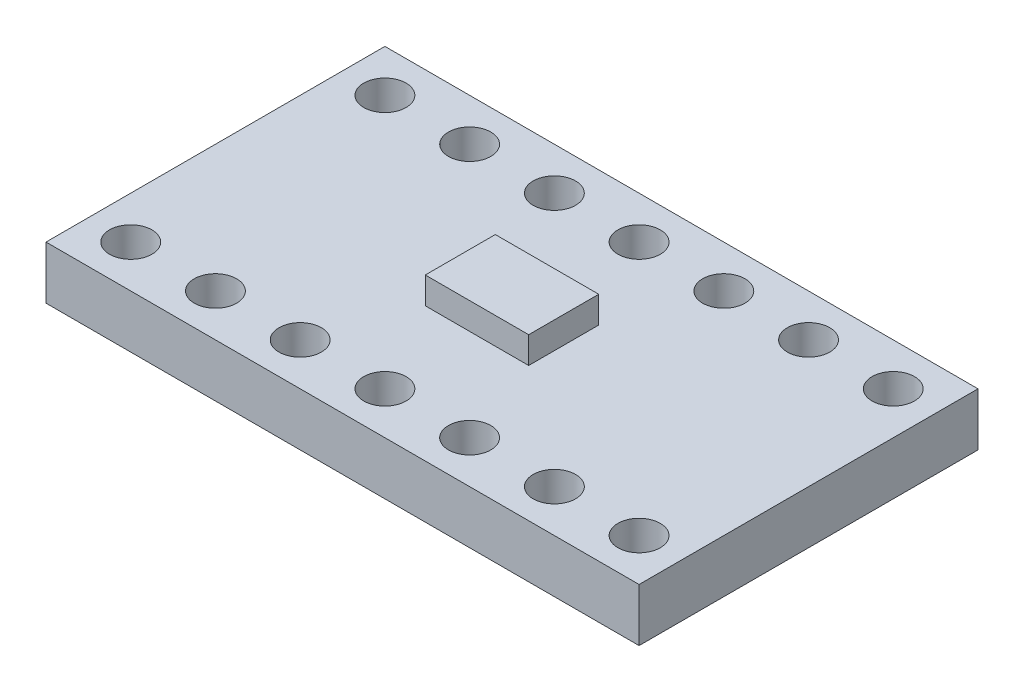
ISO-10303-21;
HEADER;
FILE_DESCRIPTION(('STEP AP214'),'2;1');
FILE_NAME('part.step','',(''),(''),'','','');
FILE_SCHEMA(('AUTOMOTIVE_DESIGN { 1 0 10303 214 1 1 1 1 }'));
ENDSEC;
DATA;
#1=APPLICATION_CONTEXT('core data for automotive mechanical design processes');
#2=APPLICATION_PROTOCOL_DEFINITION('international standard','automotive_design',2000,#1);
#3=PRODUCT_CONTEXT('',#1,'mechanical');
#4=PRODUCT('Part','Part','',(#3));
#5=PRODUCT_RELATED_PRODUCT_CATEGORY('part','',(#4));
#6=PRODUCT_DEFINITION_FORMATION('','',#4);
#7=PRODUCT_DEFINITION_CONTEXT('part definition',#1,'design');
#8=PRODUCT_DEFINITION('design','',#6,#7);
#9=PRODUCT_DEFINITION_SHAPE('','',#8);
#10=(LENGTH_UNIT() NAMED_UNIT(*) SI_UNIT(.MILLI.,.METRE.));
#11=(NAMED_UNIT(*) PLANE_ANGLE_UNIT() SI_UNIT($,.RADIAN.));
#12=(NAMED_UNIT(*) SI_UNIT($,.STERADIAN.) SOLID_ANGLE_UNIT());
#13=UNCERTAINTY_MEASURE_WITH_UNIT(LENGTH_MEASURE(1.E-05),#10,'distance_accuracy_value','');
#14=(GEOMETRIC_REPRESENTATION_CONTEXT(3) GLOBAL_UNCERTAINTY_ASSIGNED_CONTEXT((#13)) GLOBAL_UNIT_ASSIGNED_CONTEXT((#10,
#11,#12)) REPRESENTATION_CONTEXT('',''));
#15=CARTESIAN_POINT('',(0.,0.,0.));
#16=DIRECTION('',(0.,0.,1.));
#17=DIRECTION('',(1.,0.,0.));
#18=AXIS2_PLACEMENT_3D('',#15,#16,#17);
#19=CARTESIAN_POINT('',(0.,0.,0.));
#20=DIRECTION('',(0.,1.,0.));
#21=DIRECTION('',(0.,0.,1.));
#22=AXIS2_PLACEMENT_3D('',#19,#20,#21);
#23=PLANE('',#22);
#24=CARTESIAN_POINT('',(7.62,0.,3.81));
#25=DIRECTION('',(0.,1.,0.));
#26=DIRECTION('',(0.,0.,-1.));
#27=AXIS2_PLACEMENT_3D('',#24,#25,#26);
#28=CIRCLE('',#27,0.635000000000001);
#29=CARTESIAN_POINT('',(7.62,0.,3.175));
#30=VERTEX_POINT('',#29);
#31=EDGE_CURVE('E393',#30,#30,#28,.T.);
#32=ORIENTED_EDGE('',*,*,#31,.F.);
#33=EDGE_LOOP('',(#32));
#34=FACE_BOUND('',#33,.T.);
#35=CARTESIAN_POINT('',(7.62,0.,-3.81));
#36=DIRECTION('',(0.,1.,0.));
#37=DIRECTION('',(0.,0.,1.));
#38=AXIS2_PLACEMENT_3D('',#35,#36,#37);
#39=CIRCLE('',#38,0.635000000000001);
#40=CARTESIAN_POINT('',(7.62,0.,-3.175));
#41=VERTEX_POINT('',#40);
#42=EDGE_CURVE('E396',#41,#41,#39,.T.);
#43=ORIENTED_EDGE('',*,*,#42,.F.);
#44=EDGE_LOOP('',(#43));
#45=FACE_BOUND('',#44,.T.);
#46=CARTESIAN_POINT('',(5.08,0.,3.81));
#47=DIRECTION('',(0.,1.,0.));
#48=DIRECTION('',(0.,0.,-1.));
#49=AXIS2_PLACEMENT_3D('',#46,#47,#48);
#50=CIRCLE('',#49,0.635000000000001);
#51=CARTESIAN_POINT('',(5.08,0.,3.175));
#52=VERTEX_POINT('',#51);
#53=EDGE_CURVE('E405',#52,#52,#50,.T.);
#54=ORIENTED_EDGE('',*,*,#53,.F.);
#55=EDGE_LOOP('',(#54));
#56=FACE_BOUND('',#55,.T.);
#57=CARTESIAN_POINT('',(5.08,0.,-3.81));
#58=DIRECTION('',(0.,1.,0.));
#59=DIRECTION('',(0.,0.,1.));
#60=AXIS2_PLACEMENT_3D('',#57,#58,#59);
#61=CIRCLE('',#60,0.635000000000001);
#62=CARTESIAN_POINT('',(5.08,0.,-3.175));
#63=VERTEX_POINT('',#62);
#64=EDGE_CURVE('E411',#63,#63,#61,.T.);
#65=ORIENTED_EDGE('',*,*,#64,.F.);
#66=EDGE_LOOP('',(#65));
#67=FACE_BOUND('',#66,.T.);
#68=CARTESIAN_POINT('',(2.54,0.,3.81));
#69=DIRECTION('',(0.,1.,0.));
#70=DIRECTION('',(0.,0.,-1.));
#71=AXIS2_PLACEMENT_3D('',#68,#69,#70);
#72=CIRCLE('',#71,0.635000000000001);
#73=CARTESIAN_POINT('',(2.54,0.,3.175));
#74=VERTEX_POINT('',#73);
#75=EDGE_CURVE('E417',#74,#74,#72,.T.);
#76=ORIENTED_EDGE('',*,*,#75,.F.);
#77=EDGE_LOOP('',(#76));
#78=FACE_BOUND('',#77,.T.);
#79=CARTESIAN_POINT('',(2.54,0.,-3.81));
#80=DIRECTION('',(0.,1.,0.));
#81=DIRECTION('',(0.,0.,1.));
#82=AXIS2_PLACEMENT_3D('',#79,#80,#81);
#83=CIRCLE('',#82,0.635000000000001);
#84=CARTESIAN_POINT('',(2.54,0.,-3.175));
#85=VERTEX_POINT('',#84);
#86=EDGE_CURVE('E423',#85,#85,#83,.T.);
#87=ORIENTED_EDGE('',*,*,#86,.F.);
#88=EDGE_LOOP('',(#87));
#89=FACE_BOUND('',#88,.T.);
#90=CARTESIAN_POINT('',(0.,0.,3.81));
#91=DIRECTION('',(0.,1.,0.));
#92=DIRECTION('',(0.,0.,-1.));
#93=AXIS2_PLACEMENT_3D('',#90,#91,#92);
#94=CIRCLE('',#93,0.635000000000001);
#95=CARTESIAN_POINT('',(0.,0.,3.175));
#96=VERTEX_POINT('',#95);
#97=EDGE_CURVE('E429',#96,#96,#94,.T.);
#98=ORIENTED_EDGE('',*,*,#97,.F.);
#99=EDGE_LOOP('',(#98));
#100=FACE_BOUND('',#99,.T.);
#101=CARTESIAN_POINT('',(0.,0.,-3.81));
#102=DIRECTION('',(0.,1.,0.));
#103=DIRECTION('',(0.,0.,1.));
#104=AXIS2_PLACEMENT_3D('',#101,#102,#103);
#105=CIRCLE('',#104,0.635000000000001);
#106=CARTESIAN_POINT('',(0.,0.,-3.175));
#107=VERTEX_POINT('',#106);
#108=EDGE_CURVE('E435',#107,#107,#105,.T.);
#109=ORIENTED_EDGE('',*,*,#108,.F.);
#110=EDGE_LOOP('',(#109));
#111=FACE_BOUND('',#110,.T.);
#112=CARTESIAN_POINT('',(-2.54,0.,3.81));
#113=DIRECTION('',(0.,1.,0.));
#114=DIRECTION('',(0.,0.,-1.));
#115=AXIS2_PLACEMENT_3D('',#112,#113,#114);
#116=CIRCLE('',#115,0.635000000000001);
#117=CARTESIAN_POINT('',(-2.54,0.,3.175));
#118=VERTEX_POINT('',#117);
#119=EDGE_CURVE('E441',#118,#118,#116,.T.);
#120=ORIENTED_EDGE('',*,*,#119,.F.);
#121=EDGE_LOOP('',(#120));
#122=FACE_BOUND('',#121,.T.);
#123=CARTESIAN_POINT('',(-2.54,0.,-3.81));
#124=DIRECTION('',(0.,1.,0.));
#125=DIRECTION('',(0.,0.,1.));
#126=AXIS2_PLACEMENT_3D('',#123,#124,#125);
#127=CIRCLE('',#126,0.635000000000001);
#128=CARTESIAN_POINT('',(-2.54,0.,-3.175));
#129=VERTEX_POINT('',#128);
#130=EDGE_CURVE('E447',#129,#129,#127,.T.);
#131=ORIENTED_EDGE('',*,*,#130,.F.);
#132=EDGE_LOOP('',(#131));
#133=FACE_BOUND('',#132,.T.);
#134=CARTESIAN_POINT('',(-5.08,0.,3.81));
#135=DIRECTION('',(0.,1.,0.));
#136=DIRECTION('',(0.,0.,-1.));
#137=AXIS2_PLACEMENT_3D('',#134,#135,#136);
#138=CIRCLE('',#137,0.635000000000001);
#139=CARTESIAN_POINT('',(-5.08,0.,3.175));
#140=VERTEX_POINT('',#139);
#141=EDGE_CURVE('E453',#140,#140,#138,.T.);
#142=ORIENTED_EDGE('',*,*,#141,.F.);
#143=EDGE_LOOP('',(#142));
#144=FACE_BOUND('',#143,.T.);
#145=CARTESIAN_POINT('',(-5.08,0.,-3.81));
#146=DIRECTION('',(0.,1.,0.));
#147=DIRECTION('',(0.,0.,1.));
#148=AXIS2_PLACEMENT_3D('',#145,#146,#147);
#149=CIRCLE('',#148,0.635000000000001);
#150=CARTESIAN_POINT('',(-5.08,0.,-3.175));
#151=VERTEX_POINT('',#150);
#152=EDGE_CURVE('E459',#151,#151,#149,.T.);
#153=ORIENTED_EDGE('',*,*,#152,.F.);
#154=EDGE_LOOP('',(#153));
#155=FACE_BOUND('',#154,.T.);
#156=CARTESIAN_POINT('',(-7.62,0.,3.81));
#157=DIRECTION('',(0.,1.,0.));
#158=DIRECTION('',(0.,0.,-1.));
#159=AXIS2_PLACEMENT_3D('',#156,#157,#158);
#160=CIRCLE('',#159,0.635000000000001);
#161=CARTESIAN_POINT('',(-7.62,0.,3.175));
#162=VERTEX_POINT('',#161);
#163=EDGE_CURVE('E465',#162,#162,#160,.T.);
#164=ORIENTED_EDGE('',*,*,#163,.F.);
#165=EDGE_LOOP('',(#164));
#166=FACE_BOUND('',#165,.T.);
#167=CARTESIAN_POINT('',(-7.62,0.,-3.81));
#168=DIRECTION('',(0.,1.,0.));
#169=DIRECTION('',(0.,0.,1.));
#170=AXIS2_PLACEMENT_3D('',#167,#168,#169);
#171=CIRCLE('',#170,0.635000000000001);
#172=CARTESIAN_POINT('',(-7.62,0.,-3.175));
#173=VERTEX_POINT('',#172);
#174=EDGE_CURVE('E471',#173,#173,#171,.T.);
#175=ORIENTED_EDGE('',*,*,#174,.F.);
#176=EDGE_LOOP('',(#175));
#177=FACE_BOUND('',#176,.T.);
#178=DIRECTION('',(0.,0.,-1.));
#179=VECTOR('',#178,1.);
#180=CARTESIAN_POINT('',(8.89,0.,-5.08));
#181=LINE('',#180,#179);
#182=CARTESIAN_POINT('',(8.89,0.,5.08));
#183=VERTEX_POINT('',#182);
#184=CARTESIAN_POINT('',(8.89,0.,-5.08));
#185=VERTEX_POINT('',#184);
#186=EDGE_CURVE('E131',#183,#185,#181,.T.);
#187=ORIENTED_EDGE('',*,*,#186,.T.);
#188=DIRECTION('',(-1.,0.,0.));
#189=VECTOR('',#188,1.);
#190=CARTESIAN_POINT('',(-8.89,0.,-5.08));
#191=LINE('',#190,#189);
#192=CARTESIAN_POINT('',(-8.89,0.,-5.08));
#193=VERTEX_POINT('',#192);
#194=EDGE_CURVE('E134',#185,#193,#191,.T.);
#195=ORIENTED_EDGE('',*,*,#194,.T.);
#196=DIRECTION('',(0.,0.,1.));
#197=VECTOR('',#196,1.);
#198=CARTESIAN_POINT('',(-8.89,0.,-5.08));
#199=LINE('',#198,#197);
#200=CARTESIAN_POINT('',(-8.88999999999999,0.,5.08));
#201=VERTEX_POINT('',#200);
#202=EDGE_CURVE('E151',#193,#201,#199,.T.);
#203=ORIENTED_EDGE('',*,*,#202,.T.);
#204=DIRECTION('',(1.,0.,0.));
#205=VECTOR('',#204,1.);
#206=CARTESIAN_POINT('',(-8.88999999999999,0.,5.08));
#207=LINE('',#206,#205);
#208=EDGE_CURVE('E142',#201,#183,#207,.T.);
#209=ORIENTED_EDGE('',*,*,#208,.T.);
#210=EDGE_LOOP('',(#187,#195,#203,#209));
#211=FACE_BOUND('',#210,.T.);
#212=DIRECTION('',(-1.,0.,0.));
#213=VECTOR('',#212,1.);
#214=CARTESIAN_POINT('',(-1.55,0.,-1.05));
#215=LINE('',#214,#213);
#216=CARTESIAN_POINT('',(1.55,0.,-1.05));
#217=VERTEX_POINT('',#216);
#218=CARTESIAN_POINT('',(-1.55,0.,-1.05));
#219=VERTEX_POINT('',#218);
#220=EDGE_CURVE('E481',#217,#219,#215,.T.);
#221=ORIENTED_EDGE('',*,*,#220,.F.);
#222=DIRECTION('',(0.,0.,-1.));
#223=VECTOR('',#222,1.);
#224=CARTESIAN_POINT('',(1.55,0.,-1.05));
#225=LINE('',#224,#223);
#226=CARTESIAN_POINT('',(1.55,0.,1.05));
#227=VERTEX_POINT('',#226);
#228=EDGE_CURVE('E129',#227,#217,#225,.T.);
#229=ORIENTED_EDGE('',*,*,#228,.F.);
#230=DIRECTION('',(1.,0.,0.));
#231=VECTOR('',#230,1.);
#232=CARTESIAN_POINT('',(-1.55,0.,1.05));
#233=LINE('',#232,#231);
#234=CARTESIAN_POINT('',(-1.55,0.,1.05));
#235=VERTEX_POINT('',#234);
#236=EDGE_CURVE('E125',#235,#227,#233,.T.);
#237=ORIENTED_EDGE('',*,*,#236,.F.);
#238=DIRECTION('',(0.,0.,1.));
#239=VECTOR('',#238,1.);
#240=CARTESIAN_POINT('',(-1.55,0.,-1.05));
#241=LINE('',#240,#239);
#242=EDGE_CURVE('E483',#219,#235,#241,.T.);
#243=ORIENTED_EDGE('',*,*,#242,.F.);
#244=EDGE_LOOP('',(#221,#229,#237,#243));
#245=FACE_BOUND('',#244,.T.);
#246=ADVANCED_FACE('F33',(#34,#45,#56,#67,#78,#89,#100,#111,#122,#133,#144,#155,#166,#177,#211,
#245),#23,.T.);
#247=CARTESIAN_POINT('',(8.89,-1.5875,-5.08));
#248=DIRECTION('',(1.,0.,0.));
#249=DIRECTION('',(0.,0.,-1.));
#250=AXIS2_PLACEMENT_3D('',#247,#248,#249);
#251=PLANE('',#250);
#252=ORIENTED_EDGE('',*,*,#186,.F.);
#253=DIRECTION('',(0.,1.,0.));
#254=VECTOR('',#253,1.);
#255=CARTESIAN_POINT('',(8.89,-1.5875,5.08));
#256=LINE('',#255,#254);
#257=CARTESIAN_POINT('',(8.89,-1.5875,5.08));
#258=VERTEX_POINT('',#257);
#259=EDGE_CURVE('E11',#258,#183,#256,.T.);
#260=ORIENTED_EDGE('',*,*,#259,.F.);
#261=DIRECTION('',(0.,0.,-1.));
#262=VECTOR('',#261,1.);
#263=CARTESIAN_POINT('',(8.89,-1.5875,-5.08));
#264=LINE('',#263,#262);
#265=CARTESIAN_POINT('',(8.89,-1.5875,-5.08));
#266=VERTEX_POINT('',#265);
#267=EDGE_CURVE('E139',#258,#266,#264,.T.);
#268=ORIENTED_EDGE('',*,*,#267,.T.);
#269=DIRECTION('',(0.,1.,0.));
#270=VECTOR('',#269,1.);
#271=CARTESIAN_POINT('',(8.89,-1.5875,-5.08));
#272=LINE('',#271,#270);
#273=EDGE_CURVE('E37',#266,#185,#272,.T.);
#274=ORIENTED_EDGE('',*,*,#273,.T.);
#275=EDGE_LOOP('',(#252,#260,#268,#274));
#276=FACE_BOUND('',#275,.T.);
#277=ADVANCED_FACE('F35',(#276),#251,.T.);
#278=CARTESIAN_POINT('',(-8.88999999999999,-1.5875,5.08));
#279=DIRECTION('',(0.,0.,1.));
#280=DIRECTION('',(1.,0.,0.));
#281=AXIS2_PLACEMENT_3D('',#278,#279,#280);
#282=PLANE('',#281);
#283=ORIENTED_EDGE('',*,*,#208,.F.);
#284=DIRECTION('',(0.,1.,0.));
#285=VECTOR('',#284,1.);
#286=CARTESIAN_POINT('',(-8.88999999999999,-1.5875,5.08));
#287=LINE('',#286,#285);
#288=CARTESIAN_POINT('',(-8.88999999999999,-1.5875,5.08));
#289=VERTEX_POINT('',#288);
#290=EDGE_CURVE('E42',#289,#201,#287,.T.);
#291=ORIENTED_EDGE('',*,*,#290,.F.);
#292=DIRECTION('',(1.,0.,0.));
#293=VECTOR('',#292,1.);
#294=CARTESIAN_POINT('',(-8.88999999999999,-1.5875,5.08));
#295=LINE('',#294,#293);
#296=EDGE_CURVE('E147',#289,#258,#295,.T.);
#297=ORIENTED_EDGE('',*,*,#296,.T.);
#298=ORIENTED_EDGE('',*,*,#259,.T.);
#299=EDGE_LOOP('',(#283,#291,#297,#298));
#300=FACE_BOUND('',#299,.T.);
#301=ADVANCED_FACE('F161',(#300),#282,.T.);
#302=CARTESIAN_POINT('',(-8.89,-1.5875,-5.08));
#303=DIRECTION('',(-1.,0.,0.));
#304=DIRECTION('',(0.,0.,1.));
#305=AXIS2_PLACEMENT_3D('',#302,#303,#304);
#306=PLANE('',#305);
#307=ORIENTED_EDGE('',*,*,#202,.F.);
#308=DIRECTION('',(0.,1.,0.));
#309=VECTOR('',#308,1.);
#310=CARTESIAN_POINT('',(-8.89,-1.5875,-5.08));
#311=LINE('',#310,#309);
#312=CARTESIAN_POINT('',(-8.89,-1.5875,-5.08));
#313=VERTEX_POINT('',#312);
#314=EDGE_CURVE('E156',#313,#193,#311,.T.);
#315=ORIENTED_EDGE('',*,*,#314,.F.);
#316=DIRECTION('',(0.,0.,1.));
#317=VECTOR('',#316,1.);
#318=CARTESIAN_POINT('',(-8.89,-1.5875,-5.08));
#319=LINE('',#318,#317);
#320=EDGE_CURVE('E144',#313,#289,#319,.T.);
#321=ORIENTED_EDGE('',*,*,#320,.T.);
#322=ORIENTED_EDGE('',*,*,#290,.T.);
#323=EDGE_LOOP('',(#307,#315,#321,#322));
#324=FACE_BOUND('',#323,.T.);
#325=ADVANCED_FACE('F165',(#324),#306,.T.);
#326=CARTESIAN_POINT('',(-8.89,-1.5875,-5.08));
#327=DIRECTION('',(0.,0.,-1.));
#328=DIRECTION('',(-1.,0.,0.));
#329=AXIS2_PLACEMENT_3D('',#326,#327,#328);
#330=PLANE('',#329);
#331=ORIENTED_EDGE('',*,*,#194,.F.);
#332=ORIENTED_EDGE('',*,*,#273,.F.);
#333=DIRECTION('',(-1.,0.,0.));
#334=VECTOR('',#333,1.);
#335=CARTESIAN_POINT('',(-8.89,-1.5875,-5.08));
#336=LINE('',#335,#334);
#337=EDGE_CURVE('E141',#266,#313,#336,.T.);
#338=ORIENTED_EDGE('',*,*,#337,.T.);
#339=ORIENTED_EDGE('',*,*,#314,.T.);
#340=EDGE_LOOP('',(#331,#332,#338,#339));
#341=FACE_BOUND('',#340,.T.);
#342=ADVANCED_FACE('F158',(#341),#330,.T.);
#343=CARTESIAN_POINT('',(0.,-1.5875,0.));
#344=DIRECTION('',(0.,1.,0.));
#345=DIRECTION('',(0.,0.,1.));
#346=AXIS2_PLACEMENT_3D('',#343,#344,#345);
#347=PLANE('',#346);
#348=CARTESIAN_POINT('',(7.62,-1.5875,3.81));
#349=DIRECTION('',(0.,1.,0.));
#350=DIRECTION('',(0.,0.,1.));
#351=AXIS2_PLACEMENT_3D('',#348,#349,#350);
#352=CIRCLE('',#351,0.635000000000001);
#353=CARTESIAN_POINT('',(7.62,-1.5875,4.445));
#354=VERTEX_POINT('',#353);
#355=EDGE_CURVE('E395',#354,#354,#352,.F.);
#356=ORIENTED_EDGE('',*,*,#355,.F.);
#357=EDGE_LOOP('',(#356));
#358=FACE_BOUND('',#357,.T.);
#359=CARTESIAN_POINT('',(7.62,-1.5875,-3.81));
#360=DIRECTION('',(0.,1.,0.));
#361=DIRECTION('',(0.,0.,1.));
#362=AXIS2_PLACEMENT_3D('',#359,#360,#361);
#363=CIRCLE('',#362,0.635000000000001);
#364=CARTESIAN_POINT('',(7.62,-1.5875,-3.175));
#365=VERTEX_POINT('',#364);
#366=EDGE_CURVE('E399',#365,#365,#363,.F.);
#367=ORIENTED_EDGE('',*,*,#366,.F.);
#368=EDGE_LOOP('',(#367));
#369=FACE_BOUND('',#368,.T.);
#370=CARTESIAN_POINT('',(5.08,-1.5875,3.81));
#371=DIRECTION('',(0.,1.,0.));
#372=DIRECTION('',(0.,0.,1.));
#373=AXIS2_PLACEMENT_3D('',#370,#371,#372);
#374=CIRCLE('',#373,0.635000000000001);
#375=CARTESIAN_POINT('',(5.08,-1.5875,4.445));
#376=VERTEX_POINT('',#375);
#377=EDGE_CURVE('E408',#376,#376,#374,.F.);
#378=ORIENTED_EDGE('',*,*,#377,.F.);
#379=EDGE_LOOP('',(#378));
#380=FACE_BOUND('',#379,.T.);
#381=CARTESIAN_POINT('',(5.08,-1.5875,-3.81));
#382=DIRECTION('',(0.,1.,0.));
#383=DIRECTION('',(0.,0.,1.));
#384=AXIS2_PLACEMENT_3D('',#381,#382,#383);
#385=CIRCLE('',#384,0.635000000000001);
#386=CARTESIAN_POINT('',(5.08,-1.5875,-3.175));
#387=VERTEX_POINT('',#386);
#388=EDGE_CURVE('E414',#387,#387,#385,.F.);
#389=ORIENTED_EDGE('',*,*,#388,.F.);
#390=EDGE_LOOP('',(#389));
#391=FACE_BOUND('',#390,.T.);
#392=CARTESIAN_POINT('',(2.54,-1.5875,3.81));
#393=DIRECTION('',(0.,1.,0.));
#394=DIRECTION('',(0.,0.,1.));
#395=AXIS2_PLACEMENT_3D('',#392,#393,#394);
#396=CIRCLE('',#395,0.635000000000001);
#397=CARTESIAN_POINT('',(2.54,-1.5875,4.445));
#398=VERTEX_POINT('',#397);
#399=EDGE_CURVE('E420',#398,#398,#396,.F.);
#400=ORIENTED_EDGE('',*,*,#399,.F.);
#401=EDGE_LOOP('',(#400));
#402=FACE_BOUND('',#401,.T.);
#403=CARTESIAN_POINT('',(2.54,-1.5875,-3.81));
#404=DIRECTION('',(0.,1.,0.));
#405=DIRECTION('',(0.,0.,1.));
#406=AXIS2_PLACEMENT_3D('',#403,#404,#405);
#407=CIRCLE('',#406,0.635000000000001);
#408=CARTESIAN_POINT('',(2.54,-1.5875,-3.175));
#409=VERTEX_POINT('',#408);
#410=EDGE_CURVE('E426',#409,#409,#407,.F.);
#411=ORIENTED_EDGE('',*,*,#410,.F.);
#412=EDGE_LOOP('',(#411));
#413=FACE_BOUND('',#412,.T.);
#414=CARTESIAN_POINT('',(0.,-1.5875,3.81));
#415=DIRECTION('',(0.,1.,0.));
#416=DIRECTION('',(0.,0.,1.));
#417=AXIS2_PLACEMENT_3D('',#414,#415,#416);
#418=CIRCLE('',#417,0.635000000000001);
#419=CARTESIAN_POINT('',(0.,-1.5875,4.445));
#420=VERTEX_POINT('',#419);
#421=EDGE_CURVE('E432',#420,#420,#418,.F.);
#422=ORIENTED_EDGE('',*,*,#421,.F.);
#423=EDGE_LOOP('',(#422));
#424=FACE_BOUND('',#423,.T.);
#425=CARTESIAN_POINT('',(0.,-1.5875,-3.81));
#426=DIRECTION('',(0.,1.,0.));
#427=DIRECTION('',(0.,0.,1.));
#428=AXIS2_PLACEMENT_3D('',#425,#426,#427);
#429=CIRCLE('',#428,0.635000000000001);
#430=CARTESIAN_POINT('',(0.,-1.5875,-3.175));
#431=VERTEX_POINT('',#430);
#432=EDGE_CURVE('E438',#431,#431,#429,.F.);
#433=ORIENTED_EDGE('',*,*,#432,.F.);
#434=EDGE_LOOP('',(#433));
#435=FACE_BOUND('',#434,.T.);
#436=CARTESIAN_POINT('',(-2.54,-1.5875,3.81));
#437=DIRECTION('',(0.,1.,0.));
#438=DIRECTION('',(0.,0.,1.));
#439=AXIS2_PLACEMENT_3D('',#436,#437,#438);
#440=CIRCLE('',#439,0.635000000000001);
#441=CARTESIAN_POINT('',(-2.54,-1.5875,4.445));
#442=VERTEX_POINT('',#441);
#443=EDGE_CURVE('E444',#442,#442,#440,.F.);
#444=ORIENTED_EDGE('',*,*,#443,.F.);
#445=EDGE_LOOP('',(#444));
#446=FACE_BOUND('',#445,.T.);
#447=CARTESIAN_POINT('',(-2.54,-1.5875,-3.81));
#448=DIRECTION('',(0.,1.,0.));
#449=DIRECTION('',(0.,0.,1.));
#450=AXIS2_PLACEMENT_3D('',#447,#448,#449);
#451=CIRCLE('',#450,0.635000000000001);
#452=CARTESIAN_POINT('',(-2.54,-1.5875,-3.175));
#453=VERTEX_POINT('',#452);
#454=EDGE_CURVE('E450',#453,#453,#451,.F.);
#455=ORIENTED_EDGE('',*,*,#454,.F.);
#456=EDGE_LOOP('',(#455));
#457=FACE_BOUND('',#456,.T.);
#458=CARTESIAN_POINT('',(-5.08,-1.5875,3.81));
#459=DIRECTION('',(0.,1.,0.));
#460=DIRECTION('',(0.,0.,1.));
#461=AXIS2_PLACEMENT_3D('',#458,#459,#460);
#462=CIRCLE('',#461,0.635000000000001);
#463=CARTESIAN_POINT('',(-5.08,-1.5875,4.445));
#464=VERTEX_POINT('',#463);
#465=EDGE_CURVE('E456',#464,#464,#462,.F.);
#466=ORIENTED_EDGE('',*,*,#465,.F.);
#467=EDGE_LOOP('',(#466));
#468=FACE_BOUND('',#467,.T.);
#469=CARTESIAN_POINT('',(-5.08,-1.5875,-3.81));
#470=DIRECTION('',(0.,1.,0.));
#471=DIRECTION('',(0.,0.,1.));
#472=AXIS2_PLACEMENT_3D('',#469,#470,#471);
#473=CIRCLE('',#472,0.635000000000001);
#474=CARTESIAN_POINT('',(-5.08,-1.5875,-3.175));
#475=VERTEX_POINT('',#474);
#476=EDGE_CURVE('E462',#475,#475,#473,.F.);
#477=ORIENTED_EDGE('',*,*,#476,.F.);
#478=EDGE_LOOP('',(#477));
#479=FACE_BOUND('',#478,.T.);
#480=CARTESIAN_POINT('',(-7.62,-1.5875,3.81));
#481=DIRECTION('',(0.,1.,0.));
#482=DIRECTION('',(0.,0.,1.));
#483=AXIS2_PLACEMENT_3D('',#480,#481,#482);
#484=CIRCLE('',#483,0.635000000000001);
#485=CARTESIAN_POINT('',(-7.62,-1.5875,4.445));
#486=VERTEX_POINT('',#485);
#487=EDGE_CURVE('E468',#486,#486,#484,.F.);
#488=ORIENTED_EDGE('',*,*,#487,.F.);
#489=EDGE_LOOP('',(#488));
#490=FACE_BOUND('',#489,.T.);
#491=CARTESIAN_POINT('',(-7.62,-1.5875,-3.81));
#492=DIRECTION('',(0.,1.,0.));
#493=DIRECTION('',(0.,0.,1.));
#494=AXIS2_PLACEMENT_3D('',#491,#492,#493);
#495=CIRCLE('',#494,0.635000000000001);
#496=CARTESIAN_POINT('',(-7.62,-1.5875,-3.175));
#497=VERTEX_POINT('',#496);
#498=EDGE_CURVE('E474',#497,#497,#495,.F.);
#499=ORIENTED_EDGE('',*,*,#498,.F.);
#500=EDGE_LOOP('',(#499));
#501=FACE_BOUND('',#500,.T.);
#502=ORIENTED_EDGE('',*,*,#267,.F.);
#503=ORIENTED_EDGE('',*,*,#296,.F.);
#504=ORIENTED_EDGE('',*,*,#320,.F.);
#505=ORIENTED_EDGE('',*,*,#337,.F.);
#506=EDGE_LOOP('',(#502,#503,#504,#505));
#507=FACE_BOUND('',#506,.T.);
#508=ADVANCED_FACE('F167',(#358,#369,#380,#391,#402,#413,#424,#435,#446,#457,#468,#479,#490,
#501,#507),#347,.F.);
#509=CARTESIAN_POINT('',(1.55,0.8,-1.05));
#510=DIRECTION('',(-1.,0.,0.));
#511=DIRECTION('',(0.,0.,1.));
#512=AXIS2_PLACEMENT_3D('',#509,#510,#511);
#513=PLANE('',#512);
#514=ORIENTED_EDGE('',*,*,#228,.T.);
#515=DIRECTION('',(0.,-1.,0.));
#516=VECTOR('',#515,1.);
#517=CARTESIAN_POINT('',(1.55,0.8,-1.05));
#518=LINE('',#517,#516);
#519=CARTESIAN_POINT('',(1.55,0.8,-1.05));
#520=VERTEX_POINT('',#519);
#521=EDGE_CURVE('E110',#520,#217,#518,.T.);
#522=ORIENTED_EDGE('',*,*,#521,.F.);
#523=DIRECTION('',(0.,0.,-1.));
#524=VECTOR('',#523,1.);
#525=CARTESIAN_POINT('',(1.55,0.8,-1.05));
#526=LINE('',#525,#524);
#527=CARTESIAN_POINT('',(1.55,0.8,1.05));
#528=VERTEX_POINT('',#527);
#529=EDGE_CURVE('E117',#528,#520,#526,.T.);
#530=ORIENTED_EDGE('',*,*,#529,.F.);
#531=DIRECTION('',(0.,-1.,0.));
#532=VECTOR('',#531,1.);
#533=CARTESIAN_POINT('',(1.55,0.8,1.05));
#534=LINE('',#533,#532);
#535=EDGE_CURVE('E479',#528,#227,#534,.T.);
#536=ORIENTED_EDGE('',*,*,#535,.T.);
#537=EDGE_LOOP('',(#514,#522,#530,#536));
#538=FACE_BOUND('',#537,.T.);
#539=ADVANCED_FACE('F127',(#538),#513,.F.);
#540=CARTESIAN_POINT('',(-1.55,0.8,-1.05));
#541=DIRECTION('',(0.,0.,1.));
#542=DIRECTION('',(1.,0.,0.));
#543=AXIS2_PLACEMENT_3D('',#540,#541,#542);
#544=PLANE('',#543);
#545=ORIENTED_EDGE('',*,*,#220,.T.);
#546=DIRECTION('',(0.,-1.,0.));
#547=VECTOR('',#546,1.);
#548=CARTESIAN_POINT('',(-1.55,0.8,-1.05));
#549=LINE('',#548,#547);
#550=CARTESIAN_POINT('',(-1.55,0.8,-1.05));
#551=VERTEX_POINT('',#550);
#552=EDGE_CURVE('E113',#551,#219,#549,.T.);
#553=ORIENTED_EDGE('',*,*,#552,.F.);
#554=DIRECTION('',(-1.,0.,0.));
#555=VECTOR('',#554,1.);
#556=CARTESIAN_POINT('',(-1.55,0.8,-1.05));
#557=LINE('',#556,#555);
#558=EDGE_CURVE('E106',#520,#551,#557,.T.);
#559=ORIENTED_EDGE('',*,*,#558,.F.);
#560=ORIENTED_EDGE('',*,*,#521,.T.);
#561=EDGE_LOOP('',(#545,#553,#559,#560));
#562=FACE_BOUND('',#561,.T.);
#563=ADVANCED_FACE('F108',(#562),#544,.F.);
#564=CARTESIAN_POINT('',(-1.55,0.8,-1.05));
#565=DIRECTION('',(1.,0.,0.));
#566=DIRECTION('',(0.,0.,-1.));
#567=AXIS2_PLACEMENT_3D('',#564,#565,#566);
#568=PLANE('',#567);
#569=ORIENTED_EDGE('',*,*,#242,.T.);
#570=DIRECTION('',(0.,-1.,0.));
#571=VECTOR('',#570,1.);
#572=CARTESIAN_POINT('',(-1.55,0.8,1.05));
#573=LINE('',#572,#571);
#574=CARTESIAN_POINT('',(-1.55,0.8,1.05));
#575=VERTEX_POINT('',#574);
#576=EDGE_CURVE('E50',#575,#235,#573,.T.);
#577=ORIENTED_EDGE('',*,*,#576,.F.);
#578=DIRECTION('',(0.,0.,1.));
#579=VECTOR('',#578,1.);
#580=CARTESIAN_POINT('',(-1.55,0.8,-1.05));
#581=LINE('',#580,#579);
#582=EDGE_CURVE('E116',#551,#575,#581,.T.);
#583=ORIENTED_EDGE('',*,*,#582,.F.);
#584=ORIENTED_EDGE('',*,*,#552,.T.);
#585=EDGE_LOOP('',(#569,#577,#583,#584));
#586=FACE_BOUND('',#585,.T.);
#587=ADVANCED_FACE('F215',(#586),#568,.F.);
#588=CARTESIAN_POINT('',(-1.55,0.8,1.05));
#589=DIRECTION('',(0.,0.,-1.));
#590=DIRECTION('',(-1.,0.,0.));
#591=AXIS2_PLACEMENT_3D('',#588,#589,#590);
#592=PLANE('',#591);
#593=ORIENTED_EDGE('',*,*,#236,.T.);
#594=ORIENTED_EDGE('',*,*,#535,.F.);
#595=DIRECTION('',(1.,0.,0.));
#596=VECTOR('',#595,1.);
#597=CARTESIAN_POINT('',(-1.55,0.8,1.05));
#598=LINE('',#597,#596);
#599=EDGE_CURVE('E121',#575,#528,#598,.T.);
#600=ORIENTED_EDGE('',*,*,#599,.F.);
#601=ORIENTED_EDGE('',*,*,#576,.T.);
#602=EDGE_LOOP('',(#593,#594,#600,#601));
#603=FACE_BOUND('',#602,.T.);
#604=ADVANCED_FACE('F224',(#603),#592,.F.);
#605=CARTESIAN_POINT('',(0.,0.8,0.));
#606=DIRECTION('',(0.,1.,0.));
#607=DIRECTION('',(0.,0.,1.));
#608=AXIS2_PLACEMENT_3D('',#605,#606,#607);
#609=PLANE('',#608);
#610=ORIENTED_EDGE('',*,*,#529,.T.);
#611=ORIENTED_EDGE('',*,*,#558,.T.);
#612=ORIENTED_EDGE('',*,*,#582,.T.);
#613=ORIENTED_EDGE('',*,*,#599,.T.);
#614=EDGE_LOOP('',(#610,#611,#612,#613));
#615=FACE_BOUND('',#614,.T.);
#616=ADVANCED_FACE('F120',(#615),#609,.T.);
#617=CARTESIAN_POINT('',(-7.62,-1.5885,-3.81));
#618=DIRECTION('',(0.,1.,0.));
#619=DIRECTION('',(0.,0.,1.));
#620=AXIS2_PLACEMENT_3D('',#617,#618,#619);
#621=CYLINDRICAL_SURFACE('',#620,0.635000000000001);
#622=ORIENTED_EDGE('',*,*,#174,.T.);
#623=EDGE_LOOP('',(#622));
#624=FACE_BOUND('',#623,.T.);
#625=ORIENTED_EDGE('',*,*,#498,.T.);
#626=EDGE_LOOP('',(#625));
#627=FACE_BOUND('',#626,.T.);
#628=ADVANCED_FACE('F241',(#624,#627),#621,.F.);
#629=CARTESIAN_POINT('',(-7.62,-1.5885,3.81));
#630=DIRECTION('',(0.,1.,0.));
#631=DIRECTION('',(0.,0.,1.));
#632=AXIS2_PLACEMENT_3D('',#629,#630,#631);
#633=CYLINDRICAL_SURFACE('',#632,0.635000000000001);
#634=ORIENTED_EDGE('',*,*,#163,.T.);
#635=EDGE_LOOP('',(#634));
#636=FACE_BOUND('',#635,.T.);
#637=ORIENTED_EDGE('',*,*,#487,.T.);
#638=EDGE_LOOP('',(#637));
#639=FACE_BOUND('',#638,.T.);
#640=ADVANCED_FACE('F257',(#636,#639),#633,.F.);
#641=CARTESIAN_POINT('',(-5.08,-1.5885,-3.81));
#642=DIRECTION('',(0.,1.,0.));
#643=DIRECTION('',(0.,0.,1.));
#644=AXIS2_PLACEMENT_3D('',#641,#642,#643);
#645=CYLINDRICAL_SURFACE('',#644,0.635000000000001);
#646=ORIENTED_EDGE('',*,*,#152,.T.);
#647=EDGE_LOOP('',(#646));
#648=FACE_BOUND('',#647,.T.);
#649=ORIENTED_EDGE('',*,*,#476,.T.);
#650=EDGE_LOOP('',(#649));
#651=FACE_BOUND('',#650,.T.);
#652=ADVANCED_FACE('F267',(#648,#651),#645,.F.);
#653=CARTESIAN_POINT('',(-5.08,-1.5885,3.81));
#654=DIRECTION('',(0.,1.,0.));
#655=DIRECTION('',(0.,0.,1.));
#656=AXIS2_PLACEMENT_3D('',#653,#654,#655);
#657=CYLINDRICAL_SURFACE('',#656,0.635000000000001);
#658=ORIENTED_EDGE('',*,*,#141,.T.);
#659=EDGE_LOOP('',(#658));
#660=FACE_BOUND('',#659,.T.);
#661=ORIENTED_EDGE('',*,*,#465,.T.);
#662=EDGE_LOOP('',(#661));
#663=FACE_BOUND('',#662,.T.);
#664=ADVANCED_FACE('F277',(#660,#663),#657,.F.);
#665=CARTESIAN_POINT('',(-2.54,-1.5885,-3.81));
#666=DIRECTION('',(0.,1.,0.));
#667=DIRECTION('',(0.,0.,1.));
#668=AXIS2_PLACEMENT_3D('',#665,#666,#667);
#669=CYLINDRICAL_SURFACE('',#668,0.635000000000001);
#670=ORIENTED_EDGE('',*,*,#130,.T.);
#671=EDGE_LOOP('',(#670));
#672=FACE_BOUND('',#671,.T.);
#673=ORIENTED_EDGE('',*,*,#454,.T.);
#674=EDGE_LOOP('',(#673));
#675=FACE_BOUND('',#674,.T.);
#676=ADVANCED_FACE('F287',(#672,#675),#669,.F.);
#677=CARTESIAN_POINT('',(-2.54,-1.5885,3.81));
#678=DIRECTION('',(0.,1.,0.));
#679=DIRECTION('',(0.,0.,1.));
#680=AXIS2_PLACEMENT_3D('',#677,#678,#679);
#681=CYLINDRICAL_SURFACE('',#680,0.635000000000001);
#682=ORIENTED_EDGE('',*,*,#119,.T.);
#683=EDGE_LOOP('',(#682));
#684=FACE_BOUND('',#683,.T.);
#685=ORIENTED_EDGE('',*,*,#443,.T.);
#686=EDGE_LOOP('',(#685));
#687=FACE_BOUND('',#686,.T.);
#688=ADVANCED_FACE('F297',(#684,#687),#681,.F.);
#689=CARTESIAN_POINT('',(0.,-1.5885,-3.81));
#690=DIRECTION('',(0.,1.,0.));
#691=DIRECTION('',(0.,0.,1.));
#692=AXIS2_PLACEMENT_3D('',#689,#690,#691);
#693=CYLINDRICAL_SURFACE('',#692,0.635000000000001);
#694=ORIENTED_EDGE('',*,*,#108,.T.);
#695=EDGE_LOOP('',(#694));
#696=FACE_BOUND('',#695,.T.);
#697=ORIENTED_EDGE('',*,*,#432,.T.);
#698=EDGE_LOOP('',(#697));
#699=FACE_BOUND('',#698,.T.);
#700=ADVANCED_FACE('F307',(#696,#699),#693,.F.);
#701=CARTESIAN_POINT('',(0.,-1.5885,3.81));
#702=DIRECTION('',(0.,1.,0.));
#703=DIRECTION('',(0.,0.,1.));
#704=AXIS2_PLACEMENT_3D('',#701,#702,#703);
#705=CYLINDRICAL_SURFACE('',#704,0.635000000000001);
#706=ORIENTED_EDGE('',*,*,#97,.T.);
#707=EDGE_LOOP('',(#706));
#708=FACE_BOUND('',#707,.T.);
#709=ORIENTED_EDGE('',*,*,#421,.T.);
#710=EDGE_LOOP('',(#709));
#711=FACE_BOUND('',#710,.T.);
#712=ADVANCED_FACE('F317',(#708,#711),#705,.F.);
#713=CARTESIAN_POINT('',(2.54,-1.5885,-3.81));
#714=DIRECTION('',(0.,1.,0.));
#715=DIRECTION('',(0.,0.,1.));
#716=AXIS2_PLACEMENT_3D('',#713,#714,#715);
#717=CYLINDRICAL_SURFACE('',#716,0.635000000000001);
#718=ORIENTED_EDGE('',*,*,#86,.T.);
#719=EDGE_LOOP('',(#718));
#720=FACE_BOUND('',#719,.T.);
#721=ORIENTED_EDGE('',*,*,#410,.T.);
#722=EDGE_LOOP('',(#721));
#723=FACE_BOUND('',#722,.T.);
#724=ADVANCED_FACE('F327',(#720,#723),#717,.F.);
#725=CARTESIAN_POINT('',(2.54,-1.5885,3.81));
#726=DIRECTION('',(0.,1.,0.));
#727=DIRECTION('',(0.,0.,1.));
#728=AXIS2_PLACEMENT_3D('',#725,#726,#727);
#729=CYLINDRICAL_SURFACE('',#728,0.635000000000001);
#730=ORIENTED_EDGE('',*,*,#75,.T.);
#731=EDGE_LOOP('',(#730));
#732=FACE_BOUND('',#731,.T.);
#733=ORIENTED_EDGE('',*,*,#399,.T.);
#734=EDGE_LOOP('',(#733));
#735=FACE_BOUND('',#734,.T.);
#736=ADVANCED_FACE('F337',(#732,#735),#729,.F.);
#737=CARTESIAN_POINT('',(5.08,-1.5885,-3.81));
#738=DIRECTION('',(0.,1.,0.));
#739=DIRECTION('',(0.,0.,1.));
#740=AXIS2_PLACEMENT_3D('',#737,#738,#739);
#741=CYLINDRICAL_SURFACE('',#740,0.635000000000001);
#742=ORIENTED_EDGE('',*,*,#64,.T.);
#743=EDGE_LOOP('',(#742));
#744=FACE_BOUND('',#743,.T.);
#745=ORIENTED_EDGE('',*,*,#388,.T.);
#746=EDGE_LOOP('',(#745));
#747=FACE_BOUND('',#746,.T.);
#748=ADVANCED_FACE('F347',(#744,#747),#741,.F.);
#749=CARTESIAN_POINT('',(5.08,-1.5885,3.81));
#750=DIRECTION('',(0.,1.,0.));
#751=DIRECTION('',(0.,0.,1.));
#752=AXIS2_PLACEMENT_3D('',#749,#750,#751);
#753=CYLINDRICAL_SURFACE('',#752,0.635000000000001);
#754=ORIENTED_EDGE('',*,*,#53,.T.);
#755=EDGE_LOOP('',(#754));
#756=FACE_BOUND('',#755,.T.);
#757=ORIENTED_EDGE('',*,*,#377,.T.);
#758=EDGE_LOOP('',(#757));
#759=FACE_BOUND('',#758,.T.);
#760=ADVANCED_FACE('F357',(#756,#759),#753,.F.);
#761=CARTESIAN_POINT('',(7.62,-1.5885,-3.81));
#762=DIRECTION('',(0.,1.,0.));
#763=DIRECTION('',(0.,0.,1.));
#764=AXIS2_PLACEMENT_3D('',#761,#762,#763);
#765=CYLINDRICAL_SURFACE('',#764,0.635000000000001);
#766=ORIENTED_EDGE('',*,*,#42,.T.);
#767=EDGE_LOOP('',(#766));
#768=FACE_BOUND('',#767,.T.);
#769=ORIENTED_EDGE('',*,*,#366,.T.);
#770=EDGE_LOOP('',(#769));
#771=FACE_BOUND('',#770,.T.);
#772=ADVANCED_FACE('F367',(#768,#771),#765,.F.);
#773=CARTESIAN_POINT('',(7.62,-1.5885,3.81));
#774=DIRECTION('',(0.,1.,0.));
#775=DIRECTION('',(0.,0.,1.));
#776=AXIS2_PLACEMENT_3D('',#773,#774,#775);
#777=CYLINDRICAL_SURFACE('',#776,0.635000000000001);
#778=ORIENTED_EDGE('',*,*,#31,.T.);
#779=EDGE_LOOP('',(#778));
#780=FACE_BOUND('',#779,.T.);
#781=ORIENTED_EDGE('',*,*,#355,.T.);
#782=EDGE_LOOP('',(#781));
#783=FACE_BOUND('',#782,.T.);
#784=ADVANCED_FACE('F377',(#780,#783),#777,.F.);
#785=CLOSED_SHELL('',(#246,#277,#301,#325,#342,#508,#539,#563,#587,#604,#616,#628,#640,#652,
#664,#676,#688,#700,#712,#724,#736,#748,#760,#772,#784));
#786=MANIFOLD_SOLID_BREP('B2',#785);
#787=ADVANCED_BREP_SHAPE_REPRESENTATION('',(#18,#786),#14);
#788=SHAPE_DEFINITION_REPRESENTATION(#9,#787);
ENDSEC;
END-ISO-10303-21;
